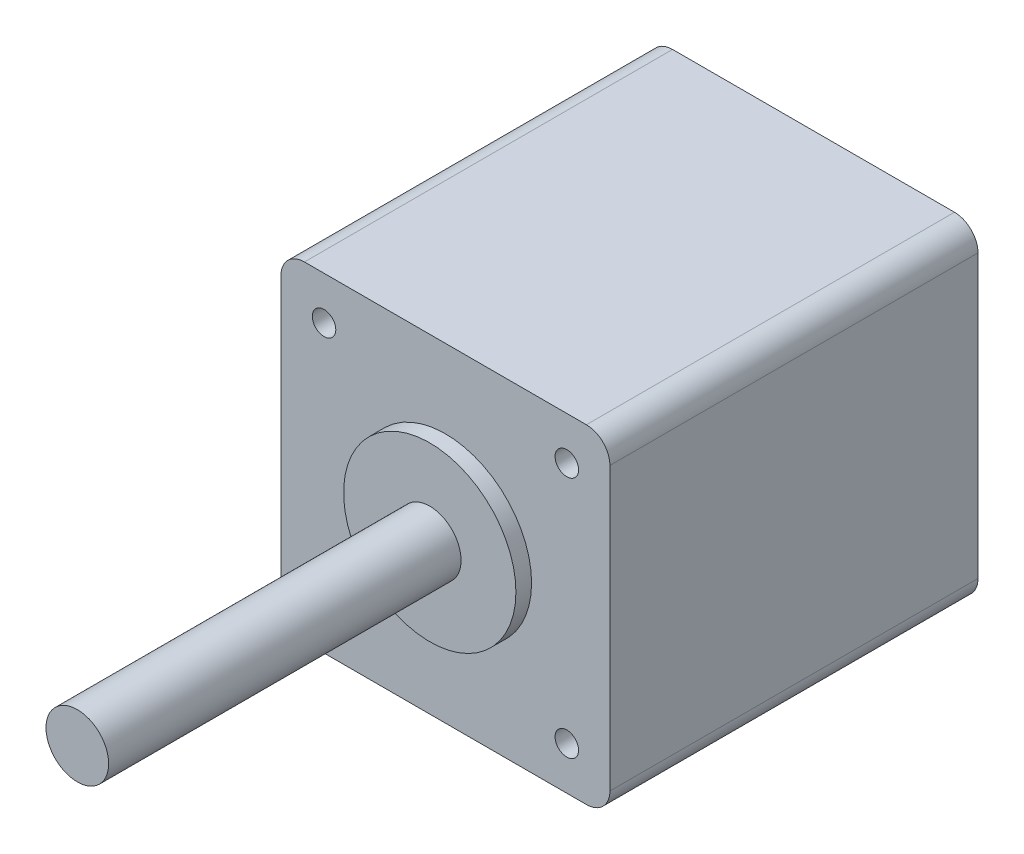
ISO-10303-21;
HEADER;
FILE_DESCRIPTION(('STEP AP214'),'2;1');
FILE_NAME('part.step','',(''),(''),'','','');
FILE_SCHEMA(('AUTOMOTIVE_DESIGN { 1 0 10303 214 1 1 1 1 }'));
ENDSEC;
DATA;
#1=APPLICATION_CONTEXT('core data for automotive mechanical design processes');
#2=APPLICATION_PROTOCOL_DEFINITION('international standard','automotive_design',2000,#1);
#3=PRODUCT_CONTEXT('',#1,'mechanical');
#4=PRODUCT('Part','Part','',(#3));
#5=PRODUCT_RELATED_PRODUCT_CATEGORY('part','',(#4));
#6=PRODUCT_DEFINITION_FORMATION('','',#4);
#7=PRODUCT_DEFINITION_CONTEXT('part definition',#1,'design');
#8=PRODUCT_DEFINITION('design','',#6,#7);
#9=PRODUCT_DEFINITION_SHAPE('','',#8);
#10=(LENGTH_UNIT() NAMED_UNIT(*) SI_UNIT(.MILLI.,.METRE.));
#11=(NAMED_UNIT(*) PLANE_ANGLE_UNIT() SI_UNIT($,.RADIAN.));
#12=(NAMED_UNIT(*) SI_UNIT($,.STERADIAN.) SOLID_ANGLE_UNIT());
#13=UNCERTAINTY_MEASURE_WITH_UNIT(LENGTH_MEASURE(1.E-05),#10,'distance_accuracy_value','');
#14=(GEOMETRIC_REPRESENTATION_CONTEXT(3) GLOBAL_UNCERTAINTY_ASSIGNED_CONTEXT((#13)) GLOBAL_UNIT_ASSIGNED_CONTEXT((#10,
#11,#12)) REPRESENTATION_CONTEXT('',''));
#15=CARTESIAN_POINT('',(0.,0.,0.));
#16=DIRECTION('',(0.,0.,1.));
#17=DIRECTION('',(1.,0.,0.));
#18=AXIS2_PLACEMENT_3D('',#15,#16,#17);
#19=CARTESIAN_POINT('',(-18.,-18.,47.));
#20=DIRECTION('',(0.,0.,-1.));
#21=DIRECTION('',(-1.,0.,0.));
#22=AXIS2_PLACEMENT_3D('',#19,#20,#21);
#23=CYLINDRICAL_SURFACE('',#22,3.);
#24=CARTESIAN_POINT('',(-18.,-18.,0.));
#25=DIRECTION('',(0.,0.,1.));
#26=DIRECTION('',(1.,0.,0.));
#27=AXIS2_PLACEMENT_3D('',#24,#25,#26);
#28=CIRCLE('',#27,3.);
#29=CARTESIAN_POINT('',(-21.,-18.,0.));
#30=VERTEX_POINT('',#29);
#31=CARTESIAN_POINT('',(-18.,-21.,0.));
#32=VERTEX_POINT('',#31);
#33=EDGE_CURVE('E139',#30,#32,#28,.T.);
#34=ORIENTED_EDGE('',*,*,#33,.T.);
#35=DIRECTION('',(0.,0.,-1.));
#36=VECTOR('',#35,1.);
#37=CARTESIAN_POINT('',(-18.,-21.,47.));
#38=LINE('',#37,#36);
#39=CARTESIAN_POINT('',(-18.,-21.,47.));
#40=VERTEX_POINT('',#39);
#41=EDGE_CURVE('E44',#40,#32,#38,.T.);
#42=ORIENTED_EDGE('',*,*,#41,.F.);
#43=CARTESIAN_POINT('',(-18.,-18.,47.));
#44=DIRECTION('',(0.,0.,1.));
#45=DIRECTION('',(1.,0.,0.));
#46=AXIS2_PLACEMENT_3D('',#43,#44,#45);
#47=CIRCLE('',#46,3.);
#48=CARTESIAN_POINT('',(-21.,-18.,47.));
#49=VERTEX_POINT('',#48);
#50=EDGE_CURVE('E98',#49,#40,#47,.T.);
#51=ORIENTED_EDGE('',*,*,#50,.F.);
#52=DIRECTION('',(0.,0.,-1.));
#53=VECTOR('',#52,1.);
#54=CARTESIAN_POINT('',(-21.,-18.,47.));
#55=LINE('',#54,#53);
#56=EDGE_CURVE('E59',#49,#30,#55,.T.);
#57=ORIENTED_EDGE('',*,*,#56,.T.);
#58=EDGE_LOOP('',(#34,#42,#51,#57));
#59=FACE_BOUND('',#58,.T.);
#60=ADVANCED_FACE('F41',(#59),#23,.T.);
#61=CARTESIAN_POINT('',(18.,-21.,47.));
#62=DIRECTION('',(0.,-1.,0.));
#63=DIRECTION('',(0.,0.,-1.));
#64=AXIS2_PLACEMENT_3D('',#61,#62,#63);
#65=PLANE('',#64);
#66=DIRECTION('',(-1.,0.,0.));
#67=VECTOR('',#66,1.);
#68=CARTESIAN_POINT('',(18.,-21.,0.));
#69=LINE('',#68,#67);
#70=CARTESIAN_POINT('',(18.,-21.,0.));
#71=VERTEX_POINT('',#70);
#72=EDGE_CURVE('E141',#71,#32,#69,.T.);
#73=ORIENTED_EDGE('',*,*,#72,.F.);
#74=DIRECTION('',(0.,0.,-1.));
#75=VECTOR('',#74,1.);
#76=CARTESIAN_POINT('',(18.,-21.,47.));
#77=LINE('',#76,#75);
#78=CARTESIAN_POINT('',(18.,-21.,47.));
#79=VERTEX_POINT('',#78);
#80=EDGE_CURVE('E165',#79,#71,#77,.T.);
#81=ORIENTED_EDGE('',*,*,#80,.F.);
#82=DIRECTION('',(-1.,0.,0.));
#83=VECTOR('',#82,1.);
#84=CARTESIAN_POINT('',(18.,-21.,47.));
#85=LINE('',#84,#83);
#86=EDGE_CURVE('E179',#79,#40,#85,.T.);
#87=ORIENTED_EDGE('',*,*,#86,.T.);
#88=ORIENTED_EDGE('',*,*,#41,.T.);
#89=EDGE_LOOP('',(#73,#81,#87,#88));
#90=FACE_BOUND('',#89,.T.);
#91=ADVANCED_FACE('F207',(#90),#65,.T.);
#92=CARTESIAN_POINT('',(18.,-18.,47.));
#93=DIRECTION('',(0.,0.,-1.));
#94=DIRECTION('',(-1.,0.,0.));
#95=AXIS2_PLACEMENT_3D('',#92,#93,#94);
#96=CYLINDRICAL_SURFACE('',#95,3.);
#97=CARTESIAN_POINT('',(18.,-18.,0.));
#98=DIRECTION('',(0.,0.,1.));
#99=DIRECTION('',(1.,0.,0.));
#100=AXIS2_PLACEMENT_3D('',#97,#98,#99);
#101=CIRCLE('',#100,3.);
#102=CARTESIAN_POINT('',(21.,-18.,0.));
#103=VERTEX_POINT('',#102);
#104=EDGE_CURVE('E145',#71,#103,#101,.T.);
#105=ORIENTED_EDGE('',*,*,#104,.T.);
#106=DIRECTION('',(0.,0.,-1.));
#107=VECTOR('',#106,1.);
#108=CARTESIAN_POINT('',(21.,-18.,47.));
#109=LINE('',#108,#107);
#110=CARTESIAN_POINT('',(21.,-18.,47.));
#111=VERTEX_POINT('',#110);
#112=EDGE_CURVE('E163',#111,#103,#109,.T.);
#113=ORIENTED_EDGE('',*,*,#112,.F.);
#114=CARTESIAN_POINT('',(18.,-18.,47.));
#115=DIRECTION('',(0.,0.,1.));
#116=DIRECTION('',(1.,0.,0.));
#117=AXIS2_PLACEMENT_3D('',#114,#115,#116);
#118=CIRCLE('',#117,3.);
#119=EDGE_CURVE('E181',#79,#111,#118,.T.);
#120=ORIENTED_EDGE('',*,*,#119,.F.);
#121=ORIENTED_EDGE('',*,*,#80,.T.);
#122=EDGE_LOOP('',(#105,#113,#120,#121));
#123=FACE_BOUND('',#122,.T.);
#124=ADVANCED_FACE('F211',(#123),#96,.T.);
#125=CARTESIAN_POINT('',(21.,-18.,47.));
#126=DIRECTION('',(-1.,0.,0.));
#127=DIRECTION('',(0.,0.,1.));
#128=AXIS2_PLACEMENT_3D('',#125,#126,#127);
#129=PLANE('',#128);
#130=DIRECTION('',(0.,1.,0.));
#131=VECTOR('',#130,1.);
#132=CARTESIAN_POINT('',(21.,-18.,0.));
#133=LINE('',#132,#131);
#134=CARTESIAN_POINT('',(21.,18.,0.));
#135=VERTEX_POINT('',#134);
#136=EDGE_CURVE('E147',#103,#135,#133,.T.);
#137=ORIENTED_EDGE('',*,*,#136,.T.);
#138=DIRECTION('',(0.,0.,-1.));
#139=VECTOR('',#138,1.);
#140=CARTESIAN_POINT('',(21.,18.,47.));
#141=LINE('',#140,#139);
#142=CARTESIAN_POINT('',(21.,18.,47.));
#143=VERTEX_POINT('',#142);
#144=EDGE_CURVE('E160',#143,#135,#141,.T.);
#145=ORIENTED_EDGE('',*,*,#144,.F.);
#146=DIRECTION('',(0.,1.,0.));
#147=VECTOR('',#146,1.);
#148=CARTESIAN_POINT('',(21.,-18.,47.));
#149=LINE('',#148,#147);
#150=EDGE_CURVE('E183',#111,#143,#149,.T.);
#151=ORIENTED_EDGE('',*,*,#150,.F.);
#152=ORIENTED_EDGE('',*,*,#112,.T.);
#153=EDGE_LOOP('',(#137,#145,#151,#152));
#154=FACE_BOUND('',#153,.T.);
#155=ADVANCED_FACE('F188',(#154),#129,.F.);
#156=CARTESIAN_POINT('',(18.,18.,47.));
#157=DIRECTION('',(0.,0.,-1.));
#158=DIRECTION('',(-1.,0.,0.));
#159=AXIS2_PLACEMENT_3D('',#156,#157,#158);
#160=CYLINDRICAL_SURFACE('',#159,3.);
#161=CARTESIAN_POINT('',(18.,18.,0.));
#162=DIRECTION('',(0.,0.,1.));
#163=DIRECTION('',(1.,0.,0.));
#164=AXIS2_PLACEMENT_3D('',#161,#162,#163);
#165=CIRCLE('',#164,3.);
#166=CARTESIAN_POINT('',(18.,21.,0.));
#167=VERTEX_POINT('',#166);
#168=EDGE_CURVE('E149',#135,#167,#165,.T.);
#169=ORIENTED_EDGE('',*,*,#168,.T.);
#170=DIRECTION('',(0.,0.,-1.));
#171=VECTOR('',#170,1.);
#172=CARTESIAN_POINT('',(18.,21.,47.));
#173=LINE('',#172,#171);
#174=CARTESIAN_POINT('',(18.,21.,47.));
#175=VERTEX_POINT('',#174);
#176=EDGE_CURVE('E131',#175,#167,#173,.T.);
#177=ORIENTED_EDGE('',*,*,#176,.F.);
#178=CARTESIAN_POINT('',(18.,18.,47.));
#179=DIRECTION('',(0.,0.,1.));
#180=DIRECTION('',(1.,0.,0.));
#181=AXIS2_PLACEMENT_3D('',#178,#179,#180);
#182=CIRCLE('',#181,3.);
#183=EDGE_CURVE('E119',#143,#175,#182,.T.);
#184=ORIENTED_EDGE('',*,*,#183,.F.);
#185=ORIENTED_EDGE('',*,*,#144,.T.);
#186=EDGE_LOOP('',(#169,#177,#184,#185));
#187=FACE_BOUND('',#186,.T.);
#188=ADVANCED_FACE('F192',(#187),#160,.T.);
#189=CARTESIAN_POINT('',(18.,21.,47.));
#190=DIRECTION('',(0.,-1.,0.));
#191=DIRECTION('',(0.,0.,-1.));
#192=AXIS2_PLACEMENT_3D('',#189,#190,#191);
#193=PLANE('',#192);
#194=DIRECTION('',(-1.,0.,0.));
#195=VECTOR('',#194,1.);
#196=CARTESIAN_POINT('',(18.,21.,0.));
#197=LINE('',#196,#195);
#198=CARTESIAN_POINT('',(-18.,21.,0.));
#199=VERTEX_POINT('',#198);
#200=EDGE_CURVE('E128',#167,#199,#197,.T.);
#201=ORIENTED_EDGE('',*,*,#200,.T.);
#202=DIRECTION('',(0.,0.,-1.));
#203=VECTOR('',#202,1.);
#204=CARTESIAN_POINT('',(-18.,21.,47.));
#205=LINE('',#204,#203);
#206=CARTESIAN_POINT('',(-18.,21.,47.));
#207=VERTEX_POINT('',#206);
#208=EDGE_CURVE('E125',#207,#199,#205,.T.);
#209=ORIENTED_EDGE('',*,*,#208,.F.);
#210=DIRECTION('',(-1.,0.,0.));
#211=VECTOR('',#210,1.);
#212=CARTESIAN_POINT('',(18.,21.,47.));
#213=LINE('',#212,#211);
#214=EDGE_CURVE('E113',#175,#207,#213,.T.);
#215=ORIENTED_EDGE('',*,*,#214,.F.);
#216=ORIENTED_EDGE('',*,*,#176,.T.);
#217=EDGE_LOOP('',(#201,#209,#215,#216));
#218=FACE_BOUND('',#217,.T.);
#219=ADVANCED_FACE('F126',(#218),#193,.F.);
#220=CARTESIAN_POINT('',(-18.,18.,47.));
#221=DIRECTION('',(0.,0.,-1.));
#222=DIRECTION('',(-1.,0.,0.));
#223=AXIS2_PLACEMENT_3D('',#220,#221,#222);
#224=CYLINDRICAL_SURFACE('',#223,3.);
#225=CARTESIAN_POINT('',(-18.,18.,0.));
#226=DIRECTION('',(0.,0.,1.));
#227=DIRECTION('',(1.,0.,0.));
#228=AXIS2_PLACEMENT_3D('',#225,#226,#227);
#229=CIRCLE('',#228,3.);
#230=CARTESIAN_POINT('',(-21.,18.,0.));
#231=VERTEX_POINT('',#230);
#232=EDGE_CURVE('E152',#199,#231,#229,.T.);
#233=ORIENTED_EDGE('',*,*,#232,.T.);
#234=DIRECTION('',(0.,0.,-1.));
#235=VECTOR('',#234,1.);
#236=CARTESIAN_POINT('',(-21.,18.,47.));
#237=LINE('',#236,#235);
#238=CARTESIAN_POINT('',(-21.,18.,47.));
#239=VERTEX_POINT('',#238);
#240=EDGE_CURVE('E86',#239,#231,#237,.T.);
#241=ORIENTED_EDGE('',*,*,#240,.F.);
#242=CARTESIAN_POINT('',(-18.,18.,47.));
#243=DIRECTION('',(0.,0.,1.));
#244=DIRECTION('',(1.,0.,0.));
#245=AXIS2_PLACEMENT_3D('',#242,#243,#244);
#246=CIRCLE('',#245,3.);
#247=EDGE_CURVE('E117',#207,#239,#246,.T.);
#248=ORIENTED_EDGE('',*,*,#247,.F.);
#249=ORIENTED_EDGE('',*,*,#208,.T.);
#250=EDGE_LOOP('',(#233,#241,#248,#249));
#251=FACE_BOUND('',#250,.T.);
#252=ADVANCED_FACE('F133',(#251),#224,.T.);
#253=CARTESIAN_POINT('',(-21.,-18.,47.));
#254=DIRECTION('',(-1.,0.,0.));
#255=DIRECTION('',(0.,0.,1.));
#256=AXIS2_PLACEMENT_3D('',#253,#254,#255);
#257=PLANE('',#256);
#258=DIRECTION('',(0.,1.,0.));
#259=VECTOR('',#258,1.);
#260=CARTESIAN_POINT('',(-21.,-18.,0.));
#261=LINE('',#260,#259);
#262=EDGE_CURVE('E154',#30,#231,#261,.T.);
#263=ORIENTED_EDGE('',*,*,#262,.F.);
#264=ORIENTED_EDGE('',*,*,#56,.F.);
#265=DIRECTION('',(0.,1.,0.));
#266=VECTOR('',#265,1.);
#267=CARTESIAN_POINT('',(-21.,-18.,47.));
#268=LINE('',#267,#266);
#269=EDGE_CURVE('E134',#49,#239,#268,.T.);
#270=ORIENTED_EDGE('',*,*,#269,.T.);
#271=ORIENTED_EDGE('',*,*,#240,.T.);
#272=EDGE_LOOP('',(#263,#264,#270,#271));
#273=FACE_BOUND('',#272,.T.);
#274=ADVANCED_FACE('F195',(#273),#257,.T.);
#275=CARTESIAN_POINT('',(-18.,-18.,47.));
#276=DIRECTION('',(0.,0.,1.));
#277=DIRECTION('',(1.,0.,0.));
#278=AXIS2_PLACEMENT_3D('',#275,#276,#277);
#279=PLANE('',#278);
#280=CARTESIAN_POINT('',(-15.5,-15.5,47.));
#281=DIRECTION('',(0.,0.,1.));
#282=DIRECTION('',(1.,0.,0.));
#283=AXIS2_PLACEMENT_3D('',#280,#281,#282);
#284=CIRCLE('',#283,1.5);
#285=CARTESIAN_POINT('',(-14.,-15.5,47.));
#286=VERTEX_POINT('',#285);
#287=EDGE_CURVE('E380',#286,#286,#284,.T.);
#288=ORIENTED_EDGE('',*,*,#287,.F.);
#289=EDGE_LOOP('',(#288));
#290=FACE_BOUND('',#289,.T.);
#291=CARTESIAN_POINT('',(15.5,-15.5,47.));
#292=DIRECTION('',(0.,0.,1.));
#293=DIRECTION('',(1.,0.,0.));
#294=AXIS2_PLACEMENT_3D('',#291,#292,#293);
#295=CIRCLE('',#294,1.5);
#296=CARTESIAN_POINT('',(17.,-15.5,47.));
#297=VERTEX_POINT('',#296);
#298=EDGE_CURVE('E379',#297,#297,#295,.T.);
#299=ORIENTED_EDGE('',*,*,#298,.F.);
#300=EDGE_LOOP('',(#299));
#301=FACE_BOUND('',#300,.T.);
#302=CARTESIAN_POINT('',(15.5,15.5,47.));
#303=DIRECTION('',(0.,0.,1.));
#304=DIRECTION('',(1.,0.,0.));
#305=AXIS2_PLACEMENT_3D('',#302,#303,#304);
#306=CIRCLE('',#305,1.5);
#307=CARTESIAN_POINT('',(17.,15.5,47.));
#308=VERTEX_POINT('',#307);
#309=EDGE_CURVE('E407',#308,#308,#306,.T.);
#310=ORIENTED_EDGE('',*,*,#309,.F.);
#311=EDGE_LOOP('',(#310));
#312=FACE_BOUND('',#311,.T.);
#313=CARTESIAN_POINT('',(-15.5,15.5,47.));
#314=DIRECTION('',(0.,0.,1.));
#315=DIRECTION('',(1.,0.,0.));
#316=AXIS2_PLACEMENT_3D('',#313,#314,#315);
#317=CIRCLE('',#316,1.5);
#318=CARTESIAN_POINT('',(-14.,15.5,47.));
#319=VERTEX_POINT('',#318);
#320=EDGE_CURVE('E393',#319,#319,#317,.T.);
#321=ORIENTED_EDGE('',*,*,#320,.F.);
#322=EDGE_LOOP('',(#321));
#323=FACE_BOUND('',#322,.T.);
#324=CARTESIAN_POINT('',(0.,0.,47.));
#325=DIRECTION('',(0.,0.,1.));
#326=DIRECTION('',(1.,0.,0.));
#327=AXIS2_PLACEMENT_3D('',#324,#325,#326);
#328=CIRCLE('',#327,11.);
#329=CARTESIAN_POINT('',(11.,0.,47.));
#330=VERTEX_POINT('',#329);
#331=EDGE_CURVE('E50',#330,#330,#328,.T.);
#332=ORIENTED_EDGE('',*,*,#331,.F.);
#333=EDGE_LOOP('',(#332));
#334=FACE_BOUND('',#333,.T.);
#335=ORIENTED_EDGE('',*,*,#50,.T.);
#336=ORIENTED_EDGE('',*,*,#86,.F.);
#337=ORIENTED_EDGE('',*,*,#119,.T.);
#338=ORIENTED_EDGE('',*,*,#150,.T.);
#339=ORIENTED_EDGE('',*,*,#183,.T.);
#340=ORIENTED_EDGE('',*,*,#214,.T.);
#341=ORIENTED_EDGE('',*,*,#247,.T.);
#342=ORIENTED_EDGE('',*,*,#269,.F.);
#343=EDGE_LOOP('',(#335,#336,#337,#338,#339,#340,#341,#342));
#344=FACE_BOUND('',#343,.T.);
#345=ADVANCED_FACE('F115',(#290,#301,#312,#323,#334,#344),#279,.T.);
#346=CARTESIAN_POINT('',(-18.,-18.,0.));
#347=DIRECTION('',(0.,0.,1.));
#348=DIRECTION('',(1.,0.,0.));
#349=AXIS2_PLACEMENT_3D('',#346,#347,#348);
#350=PLANE('',#349);
#351=ORIENTED_EDGE('',*,*,#33,.F.);
#352=ORIENTED_EDGE('',*,*,#262,.T.);
#353=ORIENTED_EDGE('',*,*,#232,.F.);
#354=ORIENTED_EDGE('',*,*,#200,.F.);
#355=ORIENTED_EDGE('',*,*,#168,.F.);
#356=ORIENTED_EDGE('',*,*,#136,.F.);
#357=ORIENTED_EDGE('',*,*,#104,.F.);
#358=ORIENTED_EDGE('',*,*,#72,.T.);
#359=EDGE_LOOP('',(#351,#352,#353,#354,#355,#356,#357,#358));
#360=FACE_BOUND('',#359,.T.);
#361=ADVANCED_FACE('F194',(#360),#350,.F.);
#362=CARTESIAN_POINT('',(0.,0.,49.));
#363=DIRECTION('',(0.,0.,-1.));
#364=DIRECTION('',(-1.,0.,0.));
#365=AXIS2_PLACEMENT_3D('',#362,#363,#364);
#366=CYLINDRICAL_SURFACE('',#365,11.);
#367=CARTESIAN_POINT('',(0.,0.,49.));
#368=DIRECTION('',(0.,0.,1.));
#369=DIRECTION('',(1.,0.,0.));
#370=AXIS2_PLACEMENT_3D('',#367,#368,#369);
#371=CIRCLE('',#370,11.);
#372=CARTESIAN_POINT('',(11.,0.,49.));
#373=VERTEX_POINT('',#372);
#374=EDGE_CURVE('E142',#373,#373,#371,.T.);
#375=ORIENTED_EDGE('',*,*,#374,.F.);
#376=EDGE_LOOP('',(#375));
#377=FACE_BOUND('',#376,.T.);
#378=ORIENTED_EDGE('',*,*,#331,.T.);
#379=EDGE_LOOP('',(#378));
#380=FACE_BOUND('',#379,.T.);
#381=ADVANCED_FACE('F244',(#377,#380),#366,.T.);
#382=CARTESIAN_POINT('',(0.,0.,49.));
#383=DIRECTION('',(0.,0.,1.));
#384=DIRECTION('',(1.,0.,0.));
#385=AXIS2_PLACEMENT_3D('',#382,#383,#384);
#386=PLANE('',#385);
#387=CARTESIAN_POINT('',(0.,0.,49.));
#388=DIRECTION('',(0.,0.,1.));
#389=DIRECTION('',(1.,0.,0.));
#390=AXIS2_PLACEMENT_3D('',#387,#388,#389);
#391=CIRCLE('',#390,4.);
#392=CARTESIAN_POINT('',(-4.,0.,49.));
#393=VERTEX_POINT('',#392);
#394=EDGE_CURVE('E11',#393,#393,#391,.T.);
#395=ORIENTED_EDGE('',*,*,#394,.F.);
#396=EDGE_LOOP('',(#395));
#397=FACE_BOUND('',#396,.T.);
#398=ORIENTED_EDGE('',*,*,#374,.T.);
#399=EDGE_LOOP('',(#398));
#400=FACE_BOUND('',#399,.T.);
#401=ADVANCED_FACE('F252',(#397,#400),#386,.T.);
#402=CARTESIAN_POINT('',(0.,0.,94.));
#403=DIRECTION('',(0.,0.,-1.));
#404=DIRECTION('',(-1.,0.,0.));
#405=AXIS2_PLACEMENT_3D('',#402,#403,#404);
#406=CYLINDRICAL_SURFACE('',#405,4.);
#407=CARTESIAN_POINT('',(0.,0.,94.));
#408=DIRECTION('',(0.,0.,1.));
#409=DIRECTION('',(1.,0.,0.));
#410=AXIS2_PLACEMENT_3D('',#407,#408,#409);
#411=CIRCLE('',#410,4.);
#412=CARTESIAN_POINT('',(-4.,0.,94.));
#413=VERTEX_POINT('',#412);
#414=EDGE_CURVE('E392',#413,#413,#411,.T.);
#415=CARTESIAN_POINT('',(-4.,0.,94.));
#416=CARTESIAN_POINT('',(-4.,0.,93.53125));
#417=CARTESIAN_POINT('',(-4.,0.,93.0625));
#418=CARTESIAN_POINT('',(-4.,0.,92.125));
#419=CARTESIAN_POINT('',(-4.,0.,91.65625));
#420=CARTESIAN_POINT('',(-4.,0.,90.71875));
#421=CARTESIAN_POINT('',(-4.,0.,90.25));
#422=CARTESIAN_POINT('',(-4.,0.,89.3125));
#423=CARTESIAN_POINT('',(-4.,0.,88.84375));
#424=CARTESIAN_POINT('',(-4.,0.,87.90625));
#425=CARTESIAN_POINT('',(-4.,0.,87.4375));
#426=CARTESIAN_POINT('',(-4.,0.,86.5));
#427=CARTESIAN_POINT('',(-4.,0.,86.03125));
#428=CARTESIAN_POINT('',(-4.,0.,85.09375));
#429=CARTESIAN_POINT('',(-4.,0.,84.625));
#430=CARTESIAN_POINT('',(-4.,0.,83.6875));
#431=CARTESIAN_POINT('',(-4.,0.,83.21875));
#432=CARTESIAN_POINT('',(-4.,0.,82.28125));
#433=CARTESIAN_POINT('',(-4.,0.,81.8125));
#434=CARTESIAN_POINT('',(-4.,0.,80.875));
#435=CARTESIAN_POINT('',(-4.,0.,80.40625));
#436=CARTESIAN_POINT('',(-4.,0.,79.46875));
#437=CARTESIAN_POINT('',(-4.,0.,79.));
#438=CARTESIAN_POINT('',(-4.,0.,78.0625));
#439=CARTESIAN_POINT('',(-4.,0.,77.59375));
#440=CARTESIAN_POINT('',(-4.,0.,76.65625));
#441=CARTESIAN_POINT('',(-4.,0.,76.1875));
#442=CARTESIAN_POINT('',(-4.,0.,75.25));
#443=CARTESIAN_POINT('',(-4.,0.,74.78125));
#444=CARTESIAN_POINT('',(-4.,0.,73.84375));
#445=CARTESIAN_POINT('',(-4.,0.,73.375));
#446=CARTESIAN_POINT('',(-4.,0.,72.4375));
#447=CARTESIAN_POINT('',(-4.,0.,71.96875));
#448=CARTESIAN_POINT('',(-4.,0.,71.03125));
#449=CARTESIAN_POINT('',(-4.,0.,70.5625));
#450=CARTESIAN_POINT('',(-4.,0.,69.625));
#451=CARTESIAN_POINT('',(-4.,0.,69.15625));
#452=CARTESIAN_POINT('',(-4.,0.,68.21875));
#453=CARTESIAN_POINT('',(-4.,0.,67.75));
#454=CARTESIAN_POINT('',(-4.,0.,66.8125));
#455=CARTESIAN_POINT('',(-4.,0.,66.34375));
#456=CARTESIAN_POINT('',(-4.,0.,65.40625));
#457=CARTESIAN_POINT('',(-4.,0.,64.9375));
#458=CARTESIAN_POINT('',(-4.,0.,64.));
#459=CARTESIAN_POINT('',(-4.,0.,63.53125));
#460=CARTESIAN_POINT('',(-4.,0.,62.59375));
#461=CARTESIAN_POINT('',(-4.,0.,62.125));
#462=CARTESIAN_POINT('',(-4.,0.,61.1875));
#463=CARTESIAN_POINT('',(-4.,0.,60.71875));
#464=CARTESIAN_POINT('',(-4.,0.,59.78125));
#465=CARTESIAN_POINT('',(-4.,0.,59.3125));
#466=CARTESIAN_POINT('',(-4.,0.,58.375));
#467=CARTESIAN_POINT('',(-4.,0.,57.90625));
#468=CARTESIAN_POINT('',(-4.,0.,56.96875));
#469=CARTESIAN_POINT('',(-4.,0.,56.5));
#470=CARTESIAN_POINT('',(-4.,0.,55.5625));
#471=CARTESIAN_POINT('',(-4.,0.,55.09375));
#472=CARTESIAN_POINT('',(-4.,0.,54.15625));
#473=CARTESIAN_POINT('',(-4.,0.,53.6875));
#474=CARTESIAN_POINT('',(-4.,0.,52.75));
#475=CARTESIAN_POINT('',(-4.,0.,52.28125));
#476=CARTESIAN_POINT('',(-4.,0.,51.34375));
#477=CARTESIAN_POINT('',(-4.,0.,50.875));
#478=CARTESIAN_POINT('',(-4.,0.,49.9375));
#479=CARTESIAN_POINT('',(-4.,0.,49.46875));
#480=CARTESIAN_POINT('',(-4.,0.,49.));
#481=B_SPLINE_CURVE_WITH_KNOTS('',3,(#415,#416,#417,#418,#419,#420,#421,#422,#423,#424,#425,
#426,#427,#428,#429,#430,#431,#432,#433,#434,#435,#436,#437,#438,#439,#440,#441,#442,#443,#444,
#445,#446,#447,#448,#449,#450,#451,#452,#453,#454,#455,#456,#457,#458,#459,#460,#461,#462,#463,
#464,#465,#466,#467,#468,#469,#470,#471,#472,#473,#474,#475,#476,#477,#478,#479,#480),
.UNSPECIFIED.,.F.,.F.,(4,2,2,2,2,2,2,2,2,2,2,2,2,2,2,2,2,2,2,2,2,2,2,2,2,2,2,2,2,2,2,2,4),(0.,
1.40625000000001,2.81250000000001,4.21875000000001,5.62500000000001,7.03125,8.4375,
9.84375000000001,11.25,12.65625,14.0625,15.46875,16.875,18.28125,19.6875,21.09375,22.5,23.90625,
25.3125,26.71875,28.125,29.53125,30.9375,32.34375,33.75,35.15625,36.5625,37.96875,39.375,
40.78125,42.1875,43.59375,45.),.UNSPECIFIED.);
#482=EDGE_CURVE('BSEAM262',#413,#393,#481,.T.);
#483=ORIENTED_EDGE('',*,*,#414,.F.);
#484=ORIENTED_EDGE('',*,*,#394,.T.);
#485=ORIENTED_EDGE('',*,*,#482,.T.);
#486=ORIENTED_EDGE('',*,*,#482,.F.);
#487=EDGE_LOOP('',(#483,#485,#484,#486));
#488=FACE_BOUND('',#487,.T.);
#489=ADVANCED_FACE('F262',(#488),#406,.T.);
#490=CARTESIAN_POINT('',(0.,0.,94.));
#491=DIRECTION('',(0.,0.,1.));
#492=DIRECTION('',(1.,0.,0.));
#493=AXIS2_PLACEMENT_3D('',#490,#491,#492);
#494=PLANE('',#493);
#495=ORIENTED_EDGE('',*,*,#414,.T.);
#496=EDGE_LOOP('',(#495));
#497=FACE_BOUND('',#496,.T.);
#498=ADVANCED_FACE('F273',(#497),#494,.T.);
#499=CARTESIAN_POINT('',(-15.5,15.5,43.5));
#500=DIRECTION('',(0.,0.,1.));
#501=DIRECTION('',(1.,0.,0.));
#502=AXIS2_PLACEMENT_3D('',#499,#500,#501);
#503=CYLINDRICAL_SURFACE('',#502,1.5);
#504=CARTESIAN_POINT('',(-15.5,15.5,43.5));
#505=DIRECTION('',(0.,0.,1.));
#506=DIRECTION('',(1.,0.,0.));
#507=AXIS2_PLACEMENT_3D('',#504,#505,#506);
#508=CIRCLE('',#507,1.5);
#509=CARTESIAN_POINT('',(-14.,15.5,43.5));
#510=VERTEX_POINT('',#509);
#511=EDGE_CURVE('E389',#510,#510,#508,.T.);
#512=ORIENTED_EDGE('',*,*,#511,.F.);
#513=EDGE_LOOP('',(#512));
#514=FACE_BOUND('',#513,.T.);
#515=ORIENTED_EDGE('',*,*,#320,.T.);
#516=EDGE_LOOP('',(#515));
#517=FACE_BOUND('',#516,.T.);
#518=ADVANCED_FACE('F285',(#514,#517),#503,.F.);
#519=CARTESIAN_POINT('',(-15.5,15.5,43.5));
#520=DIRECTION('',(0.,0.,1.));
#521=DIRECTION('',(1.,0.,0.));
#522=AXIS2_PLACEMENT_3D('',#519,#520,#521);
#523=PLANE('',#522);
#524=ORIENTED_EDGE('',*,*,#511,.T.);
#525=EDGE_LOOP('',(#524));
#526=FACE_BOUND('',#525,.T.);
#527=ADVANCED_FACE('F302',(#526),#523,.T.);
#528=CARTESIAN_POINT('',(15.5,15.5,43.5));
#529=DIRECTION('',(0.,0.,1.));
#530=DIRECTION('',(1.,0.,0.));
#531=AXIS2_PLACEMENT_3D('',#528,#529,#530);
#532=CYLINDRICAL_SURFACE('',#531,1.5);
#533=CARTESIAN_POINT('',(15.5,15.5,43.5));
#534=DIRECTION('',(0.,0.,1.));
#535=DIRECTION('',(1.,0.,0.));
#536=AXIS2_PLACEMENT_3D('',#533,#534,#535);
#537=CIRCLE('',#536,1.5);
#538=CARTESIAN_POINT('',(17.,15.5,43.5));
#539=VERTEX_POINT('',#538);
#540=EDGE_CURVE('E396',#539,#539,#537,.T.);
#541=ORIENTED_EDGE('',*,*,#540,.F.);
#542=EDGE_LOOP('',(#541));
#543=FACE_BOUND('',#542,.T.);
#544=ORIENTED_EDGE('',*,*,#309,.T.);
#545=EDGE_LOOP('',(#544));
#546=FACE_BOUND('',#545,.T.);
#547=ADVANCED_FACE('F312',(#543,#546),#532,.F.);
#548=CARTESIAN_POINT('',(15.5,15.5,43.5));
#549=DIRECTION('',(0.,0.,1.));
#550=DIRECTION('',(1.,0.,0.));
#551=AXIS2_PLACEMENT_3D('',#548,#549,#550);
#552=PLANE('',#551);
#553=ORIENTED_EDGE('',*,*,#540,.T.);
#554=EDGE_LOOP('',(#553));
#555=FACE_BOUND('',#554,.T.);
#556=ADVANCED_FACE('F322',(#555),#552,.T.);
#557=CARTESIAN_POINT('',(15.5,-15.5,43.5));
#558=DIRECTION('',(0.,0.,1.));
#559=DIRECTION('',(1.,0.,0.));
#560=AXIS2_PLACEMENT_3D('',#557,#558,#559);
#561=CYLINDRICAL_SURFACE('',#560,1.5);
#562=CARTESIAN_POINT('',(15.5,-15.5,43.5));
#563=DIRECTION('',(0.,0.,1.));
#564=DIRECTION('',(1.,0.,0.));
#565=AXIS2_PLACEMENT_3D('',#562,#563,#564);
#566=CIRCLE('',#565,1.5);
#567=CARTESIAN_POINT('',(17.,-15.5,43.5));
#568=VERTEX_POINT('',#567);
#569=EDGE_CURVE('E383',#568,#568,#566,.T.);
#570=ORIENTED_EDGE('',*,*,#569,.F.);
#571=EDGE_LOOP('',(#570));
#572=FACE_BOUND('',#571,.T.);
#573=ORIENTED_EDGE('',*,*,#298,.T.);
#574=EDGE_LOOP('',(#573));
#575=FACE_BOUND('',#574,.T.);
#576=ADVANCED_FACE('F332',(#572,#575),#561,.F.);
#577=CARTESIAN_POINT('',(15.5,-15.5,43.5));
#578=DIRECTION('',(0.,0.,1.));
#579=DIRECTION('',(1.,0.,0.));
#580=AXIS2_PLACEMENT_3D('',#577,#578,#579);
#581=PLANE('',#580);
#582=ORIENTED_EDGE('',*,*,#569,.T.);
#583=EDGE_LOOP('',(#582));
#584=FACE_BOUND('',#583,.T.);
#585=ADVANCED_FACE('F342',(#584),#581,.T.);
#586=CARTESIAN_POINT('',(-15.5,-15.5,43.5));
#587=DIRECTION('',(0.,0.,1.));
#588=DIRECTION('',(1.,0.,0.));
#589=AXIS2_PLACEMENT_3D('',#586,#587,#588);
#590=CYLINDRICAL_SURFACE('',#589,1.5);
#591=CARTESIAN_POINT('',(-15.5,-15.5,43.5));
#592=DIRECTION('',(0.,0.,1.));
#593=DIRECTION('',(1.,0.,0.));
#594=AXIS2_PLACEMENT_3D('',#591,#592,#593);
#595=CIRCLE('',#594,1.5);
#596=CARTESIAN_POINT('',(-14.,-15.5,43.5));
#597=VERTEX_POINT('',#596);
#598=EDGE_CURVE('E378',#597,#597,#595,.T.);
#599=ORIENTED_EDGE('',*,*,#598,.F.);
#600=EDGE_LOOP('',(#599));
#601=FACE_BOUND('',#600,.T.);
#602=ORIENTED_EDGE('',*,*,#287,.T.);
#603=EDGE_LOOP('',(#602));
#604=FACE_BOUND('',#603,.T.);
#605=ADVANCED_FACE('F352',(#601,#604),#590,.F.);
#606=CARTESIAN_POINT('',(-15.5,-15.5,43.5));
#607=DIRECTION('',(0.,0.,1.));
#608=DIRECTION('',(1.,0.,0.));
#609=AXIS2_PLACEMENT_3D('',#606,#607,#608);
#610=PLANE('',#609);
#611=ORIENTED_EDGE('',*,*,#598,.T.);
#612=EDGE_LOOP('',(#611));
#613=FACE_BOUND('',#612,.T.);
#614=ADVANCED_FACE('F362',(#613),#610,.T.);
#615=CLOSED_SHELL('',(#60,#91,#124,#155,#188,#219,#252,#274,#345,#361,#381,#401,#489,#498,#518,
#527,#547,#556,#576,#585,#605,#614));
#616=MANIFOLD_SOLID_BREP('B2',#615);
#617=ADVANCED_BREP_SHAPE_REPRESENTATION('',(#18,#616),#14);
#618=SHAPE_DEFINITION_REPRESENTATION(#9,#617);
ENDSEC;
END-ISO-10303-21;
